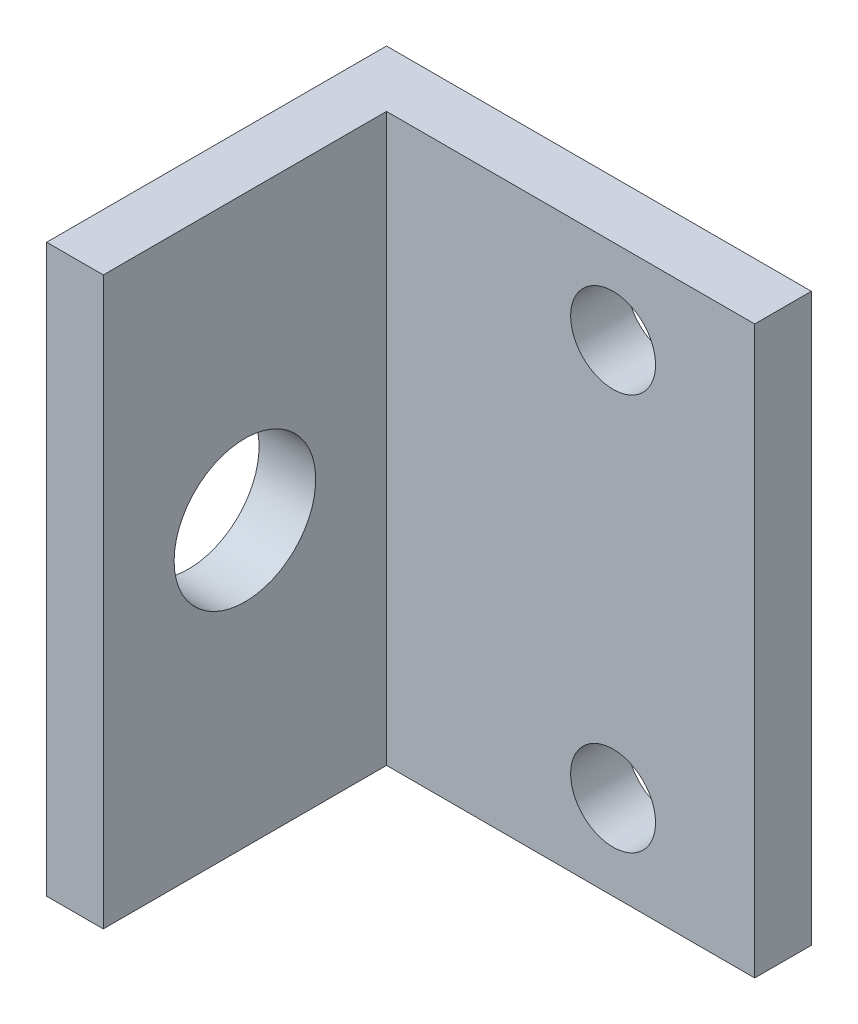
ISO-10303-21;
HEADER;
FILE_DESCRIPTION(('STEP AP214'),'2;1');
FILE_NAME('part.step','',(''),(''),'','','');
FILE_SCHEMA(('AUTOMOTIVE_DESIGN { 1 0 10303 214 1 1 1 1 }'));
ENDSEC;
DATA;
#1=APPLICATION_CONTEXT('core data for automotive mechanical design processes');
#2=APPLICATION_PROTOCOL_DEFINITION('international standard','automotive_design',2000,#1);
#3=PRODUCT_CONTEXT('',#1,'mechanical');
#4=PRODUCT('Part','Part','',(#3));
#5=PRODUCT_RELATED_PRODUCT_CATEGORY('part','',(#4));
#6=PRODUCT_DEFINITION_FORMATION('','',#4);
#7=PRODUCT_DEFINITION_CONTEXT('part definition',#1,'design');
#8=PRODUCT_DEFINITION('design','',#6,#7);
#9=PRODUCT_DEFINITION_SHAPE('','',#8);
#10=(LENGTH_UNIT() NAMED_UNIT(*) SI_UNIT(.MILLI.,.METRE.));
#11=(NAMED_UNIT(*) PLANE_ANGLE_UNIT() SI_UNIT($,.RADIAN.));
#12=(NAMED_UNIT(*) SI_UNIT($,.STERADIAN.) SOLID_ANGLE_UNIT());
#13=UNCERTAINTY_MEASURE_WITH_UNIT(LENGTH_MEASURE(1.E-05),#10,'distance_accuracy_value','');
#14=(GEOMETRIC_REPRESENTATION_CONTEXT(3) GLOBAL_UNCERTAINTY_ASSIGNED_CONTEXT((#13)) GLOBAL_UNIT_ASSIGNED_CONTEXT((#10,
#11,#12)) REPRESENTATION_CONTEXT('',''));
#15=CARTESIAN_POINT('',(0.,0.,0.));
#16=DIRECTION('',(0.,0.,1.));
#17=DIRECTION('',(1.,0.,0.));
#18=AXIS2_PLACEMENT_3D('',#15,#16,#17);
#19=CARTESIAN_POINT('',(0.,20.,-10.));
#20=DIRECTION('',(0.,0.,-1.));
#21=DIRECTION('',(-1.,0.,0.));
#22=AXIS2_PLACEMENT_3D('',#19,#20,#21);
#23=PLANE('',#22);
#24=CARTESIAN_POINT('',(10.,3.,-10.));
#25=DIRECTION('',(0.,0.,-1.));
#26=DIRECTION('',(-1.,0.,0.));
#27=AXIS2_PLACEMENT_3D('',#24,#25,#26);
#28=CIRCLE('',#27,1.5);
#29=CARTESIAN_POINT('',(8.5,3.,-10.));
#30=VERTEX_POINT('',#29);
#31=EDGE_CURVE('E162',#30,#30,#28,.T.);
#32=ORIENTED_EDGE('',*,*,#31,.T.);
#33=EDGE_LOOP('',(#32));
#34=FACE_BOUND('',#33,.T.);
#35=CARTESIAN_POINT('',(10.,17.,-10.));
#36=DIRECTION('',(0.,0.,-1.));
#37=DIRECTION('',(-1.,0.,0.));
#38=AXIS2_PLACEMENT_3D('',#35,#36,#37);
#39=CIRCLE('',#38,1.5);
#40=CARTESIAN_POINT('',(8.5,17.,-10.));
#41=VERTEX_POINT('',#40);
#42=EDGE_CURVE('E165',#41,#41,#39,.T.);
#43=ORIENTED_EDGE('',*,*,#42,.T.);
#44=EDGE_LOOP('',(#43));
#45=FACE_BOUND('',#44,.T.);
#46=DIRECTION('',(1.,0.,0.));
#47=VECTOR('',#46,1.);
#48=CARTESIAN_POINT('',(0.,0.,-10.));
#49=LINE('',#48,#47);
#50=CARTESIAN_POINT('',(2.,0.,-10.));
#51=VERTEX_POINT('',#50);
#52=CARTESIAN_POINT('',(15.,0.,-10.));
#53=VERTEX_POINT('',#52);
#54=EDGE_CURVE('E115',#51,#53,#49,.T.);
#55=ORIENTED_EDGE('',*,*,#54,.T.);
#56=DIRECTION('',(0.,-1.,0.));
#57=VECTOR('',#56,1.);
#58=CARTESIAN_POINT('',(15.,20.,-10.));
#59=LINE('',#58,#57);
#60=CARTESIAN_POINT('',(15.,20.,-10.));
#61=VERTEX_POINT('',#60);
#62=EDGE_CURVE('E11',#61,#53,#59,.T.);
#63=ORIENTED_EDGE('',*,*,#62,.F.);
#64=DIRECTION('',(1.,0.,0.));
#65=VECTOR('',#64,1.);
#66=CARTESIAN_POINT('',(0.,20.,-10.));
#67=LINE('',#66,#65);
#68=CARTESIAN_POINT('',(2.,20.,-10.));
#69=VERTEX_POINT('',#68);
#70=EDGE_CURVE('E80',#69,#61,#67,.T.);
#71=ORIENTED_EDGE('',*,*,#70,.F.);
#72=DIRECTION('',(0.,-1.,0.));
#73=VECTOR('',#72,1.);
#74=CARTESIAN_POINT('',(2.,20.,-10.));
#75=LINE('',#74,#73);
#76=EDGE_CURVE('E111',#69,#51,#75,.T.);
#77=ORIENTED_EDGE('',*,*,#76,.T.);
#78=EDGE_LOOP('',(#55,#63,#71,#77));
#79=FACE_BOUND('',#78,.T.);
#80=ADVANCED_FACE('F33',(#34,#45,#79),#23,.F.);
#81=CARTESIAN_POINT('',(15.,20.,-12.));
#82=DIRECTION('',(1.,0.,0.));
#83=DIRECTION('',(0.,0.,-1.));
#84=AXIS2_PLACEMENT_3D('',#81,#82,#83);
#85=PLANE('',#84);
#86=DIRECTION('',(0.,0.,1.));
#87=VECTOR('',#86,1.);
#88=CARTESIAN_POINT('',(15.,0.,-12.));
#89=LINE('',#88,#87);
#90=CARTESIAN_POINT('',(15.,0.,-12.));
#91=VERTEX_POINT('',#90);
#92=EDGE_CURVE('E118',#91,#53,#89,.T.);
#93=ORIENTED_EDGE('',*,*,#92,.F.);
#94=DIRECTION('',(0.,-1.,0.));
#95=VECTOR('',#94,1.);
#96=CARTESIAN_POINT('',(15.,20.,-12.));
#97=LINE('',#96,#95);
#98=CARTESIAN_POINT('',(15.,20.,-12.));
#99=VERTEX_POINT('',#98);
#100=EDGE_CURVE('E42',#99,#91,#97,.T.);
#101=ORIENTED_EDGE('',*,*,#100,.F.);
#102=DIRECTION('',(0.,0.,1.));
#103=VECTOR('',#102,1.);
#104=CARTESIAN_POINT('',(15.,20.,-12.));
#105=LINE('',#104,#103);
#106=EDGE_CURVE('E177',#99,#61,#105,.T.);
#107=ORIENTED_EDGE('',*,*,#106,.T.);
#108=ORIENTED_EDGE('',*,*,#62,.T.);
#109=EDGE_LOOP('',(#93,#101,#107,#108));
#110=FACE_BOUND('',#109,.T.);
#111=ADVANCED_FACE('F137',(#110),#85,.T.);
#112=CARTESIAN_POINT('',(0.,20.,-12.));
#113=DIRECTION('',(0.,0.,-1.));
#114=DIRECTION('',(-1.,0.,0.));
#115=AXIS2_PLACEMENT_3D('',#112,#113,#114);
#116=PLANE('',#115);
#117=CARTESIAN_POINT('',(10.,3.,-12.));
#118=DIRECTION('',(0.,0.,-1.));
#119=DIRECTION('',(-1.,0.,0.));
#120=AXIS2_PLACEMENT_3D('',#117,#118,#119);
#121=CIRCLE('',#120,1.5);
#122=CARTESIAN_POINT('',(8.5,3.,-12.));
#123=VERTEX_POINT('',#122);
#124=EDGE_CURVE('E179',#123,#123,#121,.T.);
#125=ORIENTED_EDGE('',*,*,#124,.F.);
#126=EDGE_LOOP('',(#125));
#127=FACE_BOUND('',#126,.T.);
#128=CARTESIAN_POINT('',(10.,17.,-12.));
#129=DIRECTION('',(0.,0.,-1.));
#130=DIRECTION('',(-1.,0.,0.));
#131=AXIS2_PLACEMENT_3D('',#128,#129,#130);
#132=CIRCLE('',#131,1.5);
#133=CARTESIAN_POINT('',(8.5,17.,-12.));
#134=VERTEX_POINT('',#133);
#135=EDGE_CURVE('E168',#134,#134,#132,.T.);
#136=ORIENTED_EDGE('',*,*,#135,.F.);
#137=EDGE_LOOP('',(#136));
#138=FACE_BOUND('',#137,.T.);
#139=DIRECTION('',(1.,0.,0.));
#140=VECTOR('',#139,1.);
#141=CARTESIAN_POINT('',(0.,0.,-12.));
#142=LINE('',#141,#140);
#143=CARTESIAN_POINT('',(0.,0.,-12.));
#144=VERTEX_POINT('',#143);
#145=EDGE_CURVE('E121',#144,#91,#142,.T.);
#146=ORIENTED_EDGE('',*,*,#145,.F.);
#147=DIRECTION('',(0.,-1.,0.));
#148=VECTOR('',#147,1.);
#149=CARTESIAN_POINT('',(0.,20.,-12.));
#150=LINE('',#149,#148);
#151=CARTESIAN_POINT('',(0.,20.,-12.));
#152=VERTEX_POINT('',#151);
#153=EDGE_CURVE('E101',#152,#144,#150,.T.);
#154=ORIENTED_EDGE('',*,*,#153,.F.);
#155=DIRECTION('',(1.,0.,0.));
#156=VECTOR('',#155,1.);
#157=CARTESIAN_POINT('',(0.,20.,-12.));
#158=LINE('',#157,#156);
#159=EDGE_CURVE('E107',#152,#99,#158,.T.);
#160=ORIENTED_EDGE('',*,*,#159,.T.);
#161=ORIENTED_EDGE('',*,*,#100,.T.);
#162=EDGE_LOOP('',(#146,#154,#160,#161));
#163=FACE_BOUND('',#162,.T.);
#164=ADVANCED_FACE('F134',(#127,#138,#163),#116,.T.);
#165=CARTESIAN_POINT('',(0.,20.,0.));
#166=DIRECTION('',(-1.,0.,0.));
#167=DIRECTION('',(0.,0.,1.));
#168=AXIS2_PLACEMENT_3D('',#165,#166,#167);
#169=PLANE('',#168);
#170=CARTESIAN_POINT('',(0.,10.,-5.));
#171=DIRECTION('',(-1.,0.,0.));
#172=DIRECTION('',(0.,0.,1.));
#173=AXIS2_PLACEMENT_3D('',#170,#171,#172);
#174=CIRCLE('',#173,2.5);
#175=CARTESIAN_POINT('',(0.,10.,-2.5));
#176=VERTEX_POINT('',#175);
#177=EDGE_CURVE('E167',#176,#176,#174,.T.);
#178=ORIENTED_EDGE('',*,*,#177,.F.);
#179=EDGE_LOOP('',(#178));
#180=FACE_BOUND('',#179,.T.);
#181=DIRECTION('',(0.,0.,-1.));
#182=VECTOR('',#181,1.);
#183=CARTESIAN_POINT('',(0.,0.,0.));
#184=LINE('',#183,#182);
#185=CARTESIAN_POINT('',(0.,0.,0.));
#186=VERTEX_POINT('',#185);
#187=EDGE_CURVE('E96',#186,#144,#184,.T.);
#188=ORIENTED_EDGE('',*,*,#187,.F.);
#189=DIRECTION('',(0.,-1.,0.));
#190=VECTOR('',#189,1.);
#191=CARTESIAN_POINT('',(0.,20.,0.));
#192=LINE('',#191,#190);
#193=CARTESIAN_POINT('',(0.,20.,0.));
#194=VERTEX_POINT('',#193);
#195=EDGE_CURVE('E91',#194,#186,#192,.T.);
#196=ORIENTED_EDGE('',*,*,#195,.F.);
#197=DIRECTION('',(0.,0.,-1.));
#198=VECTOR('',#197,1.);
#199=CARTESIAN_POINT('',(0.,20.,0.));
#200=LINE('',#199,#198);
#201=EDGE_CURVE('E94',#194,#152,#200,.T.);
#202=ORIENTED_EDGE('',*,*,#201,.T.);
#203=ORIENTED_EDGE('',*,*,#153,.T.);
#204=EDGE_LOOP('',(#188,#196,#202,#203));
#205=FACE_BOUND('',#204,.T.);
#206=ADVANCED_FACE('F93',(#180,#205),#169,.T.);
#207=CARTESIAN_POINT('',(2.,20.,0.));
#208=DIRECTION('',(0.,0.,1.));
#209=DIRECTION('',(1.,0.,0.));
#210=AXIS2_PLACEMENT_3D('',#207,#208,#209);
#211=PLANE('',#210);
#212=DIRECTION('',(-1.,0.,0.));
#213=VECTOR('',#212,1.);
#214=CARTESIAN_POINT('',(2.,0.,0.));
#215=LINE('',#214,#213);
#216=CARTESIAN_POINT('',(2.,0.,0.));
#217=VERTEX_POINT('',#216);
#218=EDGE_CURVE('E125',#217,#186,#215,.T.);
#219=ORIENTED_EDGE('',*,*,#218,.F.);
#220=DIRECTION('',(0.,-1.,0.));
#221=VECTOR('',#220,1.);
#222=CARTESIAN_POINT('',(2.,20.,0.));
#223=LINE('',#222,#221);
#224=CARTESIAN_POINT('',(2.,20.,0.));
#225=VERTEX_POINT('',#224);
#226=EDGE_CURVE('E71',#225,#217,#223,.T.);
#227=ORIENTED_EDGE('',*,*,#226,.F.);
#228=DIRECTION('',(-1.,0.,0.));
#229=VECTOR('',#228,1.);
#230=CARTESIAN_POINT('',(2.,20.,0.));
#231=LINE('',#230,#229);
#232=EDGE_CURVE('E105',#225,#194,#231,.T.);
#233=ORIENTED_EDGE('',*,*,#232,.T.);
#234=ORIENTED_EDGE('',*,*,#195,.T.);
#235=EDGE_LOOP('',(#219,#227,#233,#234));
#236=FACE_BOUND('',#235,.T.);
#237=ADVANCED_FACE('F109',(#236),#211,.T.);
#238=CARTESIAN_POINT('',(2.,20.,0.));
#239=DIRECTION('',(-1.,0.,0.));
#240=DIRECTION('',(0.,0.,1.));
#241=AXIS2_PLACEMENT_3D('',#238,#239,#240);
#242=PLANE('',#241);
#243=CARTESIAN_POINT('',(2.,10.,-5.));
#244=DIRECTION('',(-1.,0.,0.));
#245=DIRECTION('',(0.,0.,1.));
#246=AXIS2_PLACEMENT_3D('',#243,#244,#245);
#247=CIRCLE('',#246,2.5);
#248=CARTESIAN_POINT('',(2.,10.,-2.5));
#249=VERTEX_POINT('',#248);
#250=EDGE_CURVE('E36',#249,#249,#247,.T.);
#251=ORIENTED_EDGE('',*,*,#250,.T.);
#252=EDGE_LOOP('',(#251));
#253=FACE_BOUND('',#252,.T.);
#254=DIRECTION('',(0.,0.,-1.));
#255=VECTOR('',#254,1.);
#256=CARTESIAN_POINT('',(2.,0.,0.));
#257=LINE('',#256,#255);
#258=EDGE_CURVE('E74',#217,#51,#257,.T.);
#259=ORIENTED_EDGE('',*,*,#258,.T.);
#260=ORIENTED_EDGE('',*,*,#76,.F.);
#261=DIRECTION('',(0.,0.,-1.));
#262=VECTOR('',#261,1.);
#263=CARTESIAN_POINT('',(2.,20.,0.));
#264=LINE('',#263,#262);
#265=EDGE_CURVE('E50',#225,#69,#264,.T.);
#266=ORIENTED_EDGE('',*,*,#265,.F.);
#267=ORIENTED_EDGE('',*,*,#226,.T.);
#268=EDGE_LOOP('',(#259,#260,#266,#267));
#269=FACE_BOUND('',#268,.T.);
#270=ADVANCED_FACE('F142',(#253,#269),#242,.F.);
#271=CARTESIAN_POINT('',(0.,20.,0.));
#272=DIRECTION('',(0.,-1.,0.));
#273=DIRECTION('',(-1.,0.,0.));
#274=AXIS2_PLACEMENT_3D('',#271,#272,#273);
#275=PLANE('',#274);
#276=ORIENTED_EDGE('',*,*,#70,.T.);
#277=ORIENTED_EDGE('',*,*,#106,.F.);
#278=ORIENTED_EDGE('',*,*,#159,.F.);
#279=ORIENTED_EDGE('',*,*,#201,.F.);
#280=ORIENTED_EDGE('',*,*,#232,.F.);
#281=ORIENTED_EDGE('',*,*,#265,.T.);
#282=EDGE_LOOP('',(#276,#277,#278,#279,#280,#281));
#283=FACE_BOUND('',#282,.T.);
#284=ADVANCED_FACE('F104',(#283),#275,.F.);
#285=CARTESIAN_POINT('',(0.,0.,0.));
#286=DIRECTION('',(0.,-1.,0.));
#287=DIRECTION('',(-1.,0.,0.));
#288=AXIS2_PLACEMENT_3D('',#285,#286,#287);
#289=PLANE('',#288);
#290=ORIENTED_EDGE('',*,*,#54,.F.);
#291=ORIENTED_EDGE('',*,*,#258,.F.);
#292=ORIENTED_EDGE('',*,*,#218,.T.);
#293=ORIENTED_EDGE('',*,*,#187,.T.);
#294=ORIENTED_EDGE('',*,*,#145,.T.);
#295=ORIENTED_EDGE('',*,*,#92,.T.);
#296=EDGE_LOOP('',(#290,#291,#292,#293,#294,#295));
#297=FACE_BOUND('',#296,.T.);
#298=ADVANCED_FACE('F140',(#297),#289,.T.);
#299=CARTESIAN_POINT('',(10.,10.,-5.));
#300=DIRECTION('',(-1.,0.,0.));
#301=DIRECTION('',(0.,0.,1.));
#302=AXIS2_PLACEMENT_3D('',#299,#300,#301);
#303=CYLINDRICAL_SURFACE('',#302,2.5);
#304=ORIENTED_EDGE('',*,*,#177,.T.);
#305=EDGE_LOOP('',(#304));
#306=FACE_BOUND('',#305,.T.);
#307=ORIENTED_EDGE('',*,*,#250,.F.);
#308=EDGE_LOOP('',(#307));
#309=FACE_BOUND('',#308,.T.);
#310=ADVANCED_FACE('F193',(#306,#309),#303,.F.);
#311=CARTESIAN_POINT('',(10.,17.,-2.));
#312=DIRECTION('',(0.,0.,-1.));
#313=DIRECTION('',(-1.,0.,0.));
#314=AXIS2_PLACEMENT_3D('',#311,#312,#313);
#315=CYLINDRICAL_SURFACE('',#314,1.5);
#316=ORIENTED_EDGE('',*,*,#135,.T.);
#317=EDGE_LOOP('',(#316));
#318=FACE_BOUND('',#317,.T.);
#319=ORIENTED_EDGE('',*,*,#42,.F.);
#320=EDGE_LOOP('',(#319));
#321=FACE_BOUND('',#320,.T.);
#322=ADVANCED_FACE('F191',(#318,#321),#315,.F.);
#323=CARTESIAN_POINT('',(10.,3.,-2.));
#324=DIRECTION('',(0.,0.,-1.));
#325=DIRECTION('',(-1.,0.,0.));
#326=AXIS2_PLACEMENT_3D('',#323,#324,#325);
#327=CYLINDRICAL_SURFACE('',#326,1.5);
#328=ORIENTED_EDGE('',*,*,#124,.T.);
#329=EDGE_LOOP('',(#328));
#330=FACE_BOUND('',#329,.T.);
#331=ORIENTED_EDGE('',*,*,#31,.F.);
#332=EDGE_LOOP('',(#331));
#333=FACE_BOUND('',#332,.T.);
#334=ADVANCED_FACE('F183',(#330,#333),#327,.F.);
#335=CLOSED_SHELL('',(#80,#111,#164,#206,#237,#270,#284,#298,#310,#322,#334));
#336=MANIFOLD_SOLID_BREP('B2',#335);
#337=ADVANCED_BREP_SHAPE_REPRESENTATION('',(#18,#336),#14);
#338=SHAPE_DEFINITION_REPRESENTATION(#9,#337);
ENDSEC;
END-ISO-10303-21;
